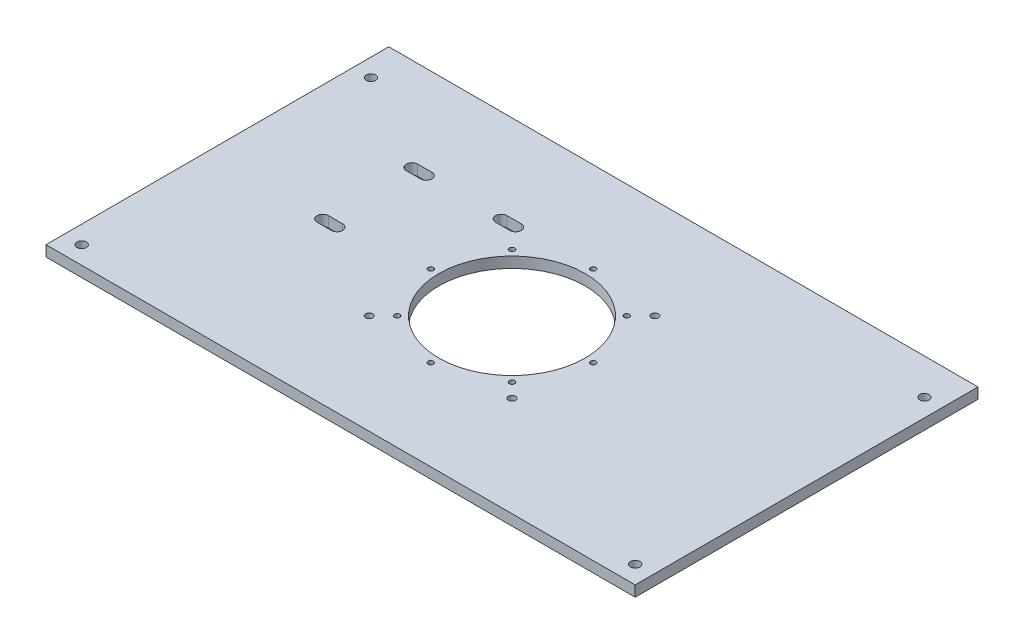
ISO-10303-21;
HEADER;
FILE_DESCRIPTION(('STEP AP214'),'2;1');
FILE_NAME('part.step','',(''),(''),'','','');
FILE_SCHEMA(('AUTOMOTIVE_DESIGN { 1 0 10303 214 1 1 1 1 }'));
ENDSEC;
DATA;
#1=APPLICATION_CONTEXT('core data for automotive mechanical design processes');
#2=APPLICATION_PROTOCOL_DEFINITION('international standard','automotive_design',2000,#1);
#3=PRODUCT_CONTEXT('',#1,'mechanical');
#4=PRODUCT('Part','Part','',(#3));
#5=PRODUCT_RELATED_PRODUCT_CATEGORY('part','',(#4));
#6=PRODUCT_DEFINITION_FORMATION('','',#4);
#7=PRODUCT_DEFINITION_CONTEXT('part definition',#1,'design');
#8=PRODUCT_DEFINITION('design','',#6,#7);
#9=PRODUCT_DEFINITION_SHAPE('','',#8);
#10=(LENGTH_UNIT() NAMED_UNIT(*) SI_UNIT(.MILLI.,.METRE.));
#11=(NAMED_UNIT(*) PLANE_ANGLE_UNIT() SI_UNIT($,.RADIAN.));
#12=(NAMED_UNIT(*) SI_UNIT($,.STERADIAN.) SOLID_ANGLE_UNIT());
#13=UNCERTAINTY_MEASURE_WITH_UNIT(LENGTH_MEASURE(1.E-05),#10,'distance_accuracy_value','');
#14=(GEOMETRIC_REPRESENTATION_CONTEXT(3) GLOBAL_UNCERTAINTY_ASSIGNED_CONTEXT((#13)) GLOBAL_UNIT_ASSIGNED_CONTEXT((#10,
#11,#12)) REPRESENTATION_CONTEXT('',''));
#15=CARTESIAN_POINT('',(0.,0.,0.));
#16=DIRECTION('',(0.,0.,1.));
#17=DIRECTION('',(1.,0.,0.));
#18=AXIS2_PLACEMENT_3D('',#15,#16,#17);
#19=CARTESIAN_POINT('',(0.,6.,0.));
#20=DIRECTION('',(1.,0.,0.));
#21=DIRECTION('',(0.,0.,-1.));
#22=AXIS2_PLACEMENT_3D('',#19,#20,#21);
#23=PLANE('',#22);
#24=DIRECTION('',(0.,0.,1.));
#25=VECTOR('',#24,1.);
#26=CARTESIAN_POINT('',(0.,0.,0.));
#27=LINE('',#26,#25);
#28=CARTESIAN_POINT('',(0.,0.,-192.));
#29=VERTEX_POINT('',#28);
#30=CARTESIAN_POINT('',(0.,0.,0.));
#31=VERTEX_POINT('',#30);
#32=EDGE_CURVE('E308',#29,#31,#27,.T.);
#33=ORIENTED_EDGE('',*,*,#32,.T.);
#34=DIRECTION('',(0.,-1.,0.));
#35=VECTOR('',#34,1.);
#36=CARTESIAN_POINT('',(0.,6.,0.));
#37=LINE('',#36,#35);
#38=CARTESIAN_POINT('',(0.,6.,0.));
#39=VERTEX_POINT('',#38);
#40=EDGE_CURVE('E11',#39,#31,#37,.T.);
#41=ORIENTED_EDGE('',*,*,#40,.F.);
#42=DIRECTION('',(0.,0.,1.));
#43=VECTOR('',#42,1.);
#44=CARTESIAN_POINT('',(0.,6.,0.));
#45=LINE('',#44,#43);
#46=CARTESIAN_POINT('',(0.,6.,-192.));
#47=VERTEX_POINT('',#46);
#48=EDGE_CURVE('E309',#47,#39,#45,.T.);
#49=ORIENTED_EDGE('',*,*,#48,.F.);
#50=DIRECTION('',(0.,-1.,0.));
#51=VECTOR('',#50,1.);
#52=CARTESIAN_POINT('',(0.,6.,-192.));
#53=LINE('',#52,#51);
#54=EDGE_CURVE('E319',#47,#29,#53,.T.);
#55=ORIENTED_EDGE('',*,*,#54,.T.);
#56=EDGE_LOOP('',(#33,#41,#49,#55));
#57=FACE_BOUND('',#56,.T.);
#58=ADVANCED_FACE('F38',(#57),#23,.F.);
#59=CARTESIAN_POINT('',(0.,6.,0.));
#60=DIRECTION('',(0.,0.,-1.));
#61=DIRECTION('',(-1.,0.,0.));
#62=AXIS2_PLACEMENT_3D('',#59,#60,#61);
#63=PLANE('',#62);
#64=DIRECTION('',(1.,0.,0.));
#65=VECTOR('',#64,1.);
#66=CARTESIAN_POINT('',(0.,0.,0.));
#67=LINE('',#66,#65);
#68=CARTESIAN_POINT('',(330.,0.,0.));
#69=VERTEX_POINT('',#68);
#70=EDGE_CURVE('E322',#31,#69,#67,.T.);
#71=ORIENTED_EDGE('',*,*,#70,.T.);
#72=DIRECTION('',(0.,-1.,0.));
#73=VECTOR('',#72,1.);
#74=CARTESIAN_POINT('',(330.,6.,0.));
#75=LINE('',#74,#73);
#76=CARTESIAN_POINT('',(330.,6.,0.));
#77=VERTEX_POINT('',#76);
#78=EDGE_CURVE('E46',#77,#69,#75,.T.);
#79=ORIENTED_EDGE('',*,*,#78,.F.);
#80=DIRECTION('',(1.,0.,0.));
#81=VECTOR('',#80,1.);
#82=CARTESIAN_POINT('',(0.,6.,0.));
#83=LINE('',#82,#81);
#84=EDGE_CURVE('E312',#39,#77,#83,.T.);
#85=ORIENTED_EDGE('',*,*,#84,.F.);
#86=ORIENTED_EDGE('',*,*,#40,.T.);
#87=EDGE_LOOP('',(#71,#79,#85,#86));
#88=FACE_BOUND('',#87,.T.);
#89=ADVANCED_FACE('F416',(#88),#63,.F.);
#90=CARTESIAN_POINT('',(330.,6.,0.));
#91=DIRECTION('',(-1.,0.,0.));
#92=DIRECTION('',(0.,0.,1.));
#93=AXIS2_PLACEMENT_3D('',#90,#91,#92);
#94=PLANE('',#93);
#95=DIRECTION('',(0.,0.,-1.));
#96=VECTOR('',#95,1.);
#97=CARTESIAN_POINT('',(330.,0.,0.));
#98=LINE('',#97,#96);
#99=CARTESIAN_POINT('',(330.,0.,-192.));
#100=VERTEX_POINT('',#99);
#101=EDGE_CURVE('E324',#69,#100,#98,.T.);
#102=ORIENTED_EDGE('',*,*,#101,.T.);
#103=DIRECTION('',(0.,-1.,0.));
#104=VECTOR('',#103,1.);
#105=CARTESIAN_POINT('',(330.,6.,-192.));
#106=LINE('',#105,#104);
#107=CARTESIAN_POINT('',(330.,6.,-192.));
#108=VERTEX_POINT('',#107);
#109=EDGE_CURVE('E329',#108,#100,#106,.T.);
#110=ORIENTED_EDGE('',*,*,#109,.F.);
#111=DIRECTION('',(0.,0.,-1.));
#112=VECTOR('',#111,1.);
#113=CARTESIAN_POINT('',(330.,6.,0.));
#114=LINE('',#113,#112);
#115=EDGE_CURVE('E315',#77,#108,#114,.T.);
#116=ORIENTED_EDGE('',*,*,#115,.F.);
#117=ORIENTED_EDGE('',*,*,#78,.T.);
#118=EDGE_LOOP('',(#102,#110,#116,#117));
#119=FACE_BOUND('',#118,.T.);
#120=ADVANCED_FACE('F421',(#119),#94,.F.);
#121=CARTESIAN_POINT('',(0.,6.,-192.));
#122=DIRECTION('',(0.,0.,1.));
#123=DIRECTION('',(1.,0.,0.));
#124=AXIS2_PLACEMENT_3D('',#121,#122,#123);
#125=PLANE('',#124);
#126=DIRECTION('',(-1.,0.,0.));
#127=VECTOR('',#126,1.);
#128=CARTESIAN_POINT('',(0.,0.,-192.));
#129=LINE('',#128,#127);
#130=EDGE_CURVE('E313',#100,#29,#129,.T.);
#131=ORIENTED_EDGE('',*,*,#130,.T.);
#132=ORIENTED_EDGE('',*,*,#54,.F.);
#133=DIRECTION('',(-1.,0.,0.));
#134=VECTOR('',#133,1.);
#135=CARTESIAN_POINT('',(0.,6.,-192.));
#136=LINE('',#135,#134);
#137=EDGE_CURVE('E317',#108,#47,#136,.T.);
#138=ORIENTED_EDGE('',*,*,#137,.F.);
#139=ORIENTED_EDGE('',*,*,#109,.T.);
#140=EDGE_LOOP('',(#131,#132,#138,#139));
#141=FACE_BOUND('',#140,.T.);
#142=ADVANCED_FACE('F383',(#141),#125,.F.);
#143=CARTESIAN_POINT('',(0.,6.,0.));
#144=DIRECTION('',(0.,-1.,0.));
#145=DIRECTION('',(0.,0.,-1.));
#146=AXIS2_PLACEMENT_3D('',#143,#144,#145);
#147=PLANE('',#146);
#148=CARTESIAN_POINT('',(10.,6.,-172.));
#149=DIRECTION('',(0.,1.,0.));
#150=DIRECTION('',(0.,0.,1.));
#151=AXIS2_PLACEMENT_3D('',#148,#149,#150);
#152=CIRCLE('',#151,2.65);
#153=CARTESIAN_POINT('',(10.,6.,-169.35));
#154=VERTEX_POINT('',#153);
#155=EDGE_CURVE('E354',#154,#154,#152,.T.);
#156=ORIENTED_EDGE('',*,*,#155,.F.);
#157=EDGE_LOOP('',(#156));
#158=FACE_BOUND('',#157,.T.);
#159=CARTESIAN_POINT('',(10.,6.,-10.));
#160=DIRECTION('',(0.,1.,0.));
#161=DIRECTION('',(0.,0.,1.));
#162=AXIS2_PLACEMENT_3D('',#159,#160,#161);
#163=CIRCLE('',#162,2.65);
#164=CARTESIAN_POINT('',(10.,6.,-7.35000000000001));
#165=VERTEX_POINT('',#164);
#166=EDGE_CURVE('E344',#165,#165,#163,.T.);
#167=ORIENTED_EDGE('',*,*,#166,.F.);
#168=EDGE_LOOP('',(#167));
#169=FACE_BOUND('',#168,.T.);
#170=CARTESIAN_POINT('',(320.,6.,-10.));
#171=DIRECTION('',(0.,1.,0.));
#172=DIRECTION('',(0.,0.,1.));
#173=AXIS2_PLACEMENT_3D('',#170,#171,#172);
#174=CIRCLE('',#173,2.64999999999999);
#175=CARTESIAN_POINT('',(320.,6.,-7.35000000000002));
#176=VERTEX_POINT('',#175);
#177=EDGE_CURVE('E341',#176,#176,#174,.T.);
#178=ORIENTED_EDGE('',*,*,#177,.F.);
#179=EDGE_LOOP('',(#178));
#180=FACE_BOUND('',#179,.T.);
#181=CARTESIAN_POINT('',(320.,6.,-172.));
#182=DIRECTION('',(0.,1.,0.));
#183=DIRECTION('',(0.,0.,1.));
#184=AXIS2_PLACEMENT_3D('',#181,#182,#183);
#185=CIRCLE('',#184,2.64999999999999);
#186=CARTESIAN_POINT('',(320.,6.,-169.35));
#187=VERTEX_POINT('',#186);
#188=EDGE_CURVE('E338',#187,#187,#185,.T.);
#189=ORIENTED_EDGE('',*,*,#188,.F.);
#190=EDGE_LOOP('',(#189));
#191=FACE_BOUND('',#190,.T.);
#192=CARTESIAN_POINT('',(205.,6.,-136.));
#193=DIRECTION('',(0.,-1.,0.));
#194=DIRECTION('',(0.,0.,-1.));
#195=AXIS2_PLACEMENT_3D('',#192,#193,#194);
#196=CIRCLE('',#195,2.);
#197=CARTESIAN_POINT('',(205.,6.,-138.));
#198=VERTEX_POINT('',#197);
#199=EDGE_CURVE('E206',#198,#198,#196,.T.);
#200=ORIENTED_EDGE('',*,*,#199,.T.);
#201=EDGE_LOOP('',(#200));
#202=FACE_BOUND('',#201,.T.);
#203=CARTESIAN_POINT('',(205.,6.,-56.));
#204=DIRECTION('',(0.,-1.,0.));
#205=DIRECTION('',(0.,0.,-1.));
#206=AXIS2_PLACEMENT_3D('',#203,#204,#205);
#207=CIRCLE('',#206,2.);
#208=CARTESIAN_POINT('',(205.,6.,-58.));
#209=VERTEX_POINT('',#208);
#210=EDGE_CURVE('E370',#209,#209,#207,.T.);
#211=ORIENTED_EDGE('',*,*,#210,.T.);
#212=EDGE_LOOP('',(#211));
#213=FACE_BOUND('',#212,.T.);
#214=CARTESIAN_POINT('',(125.,6.,-56.));
#215=DIRECTION('',(0.,-1.,0.));
#216=DIRECTION('',(0.,0.,-1.));
#217=AXIS2_PLACEMENT_3D('',#214,#215,#216);
#218=CIRCLE('',#217,2.);
#219=CARTESIAN_POINT('',(125.,6.,-58.));
#220=VERTEX_POINT('',#219);
#221=EDGE_CURVE('E362',#220,#220,#218,.T.);
#222=ORIENTED_EDGE('',*,*,#221,.T.);
#223=EDGE_LOOP('',(#222));
#224=FACE_BOUND('',#223,.T.);
#225=CARTESIAN_POINT('',(123.,6.,-140.));
#226=DIRECTION('',(0.,-1.,0.));
#227=DIRECTION('',(0.,0.,-1.));
#228=AXIS2_PLACEMENT_3D('',#225,#226,#227);
#229=CIRCLE('',#228,3.20000000000001);
#230=CARTESIAN_POINT('',(123.,6.,-143.2));
#231=VERTEX_POINT('',#230);
#232=CARTESIAN_POINT('',(123.,6.,-136.8));
#233=VERTEX_POINT('',#232);
#234=EDGE_CURVE('E248',#231,#233,#229,.T.);
#235=ORIENTED_EDGE('',*,*,#234,.T.);
#236=DIRECTION('',(-1.,0.,0.));
#237=VECTOR('',#236,1.);
#238=CARTESIAN_POINT('',(0.,6.,-136.8));
#239=LINE('',#238,#237);
#240=CARTESIAN_POINT('',(115.,6.,-136.8));
#241=VERTEX_POINT('',#240);
#242=EDGE_CURVE('E251',#233,#241,#239,.T.);
#243=ORIENTED_EDGE('',*,*,#242,.T.);
#244=CARTESIAN_POINT('',(115.,6.,-140.));
#245=DIRECTION('',(0.,-1.,0.));
#246=DIRECTION('',(0.,0.,-1.));
#247=AXIS2_PLACEMENT_3D('',#244,#245,#246);
#248=CIRCLE('',#247,3.19999999999998);
#249=CARTESIAN_POINT('',(115.,6.,-143.2));
#250=VERTEX_POINT('',#249);
#251=EDGE_CURVE('E245',#241,#250,#248,.T.);
#252=ORIENTED_EDGE('',*,*,#251,.T.);
#253=DIRECTION('',(-1.,0.,0.));
#254=VECTOR('',#253,1.);
#255=CARTESIAN_POINT('',(0.,6.,-143.2));
#256=LINE('',#255,#254);
#257=EDGE_CURVE('E157',#231,#250,#256,.T.);
#258=ORIENTED_EDGE('',*,*,#257,.F.);
#259=EDGE_LOOP('',(#235,#243,#252,#258));
#260=FACE_BOUND('',#259,.T.);
#261=CARTESIAN_POINT('',(73.,6.,-140.));
#262=DIRECTION('',(0.,-1.,0.));
#263=DIRECTION('',(0.,0.,-1.));
#264=AXIS2_PLACEMENT_3D('',#261,#262,#263);
#265=CIRCLE('',#264,3.19999999999999);
#266=CARTESIAN_POINT('',(73.,6.,-143.2));
#267=VERTEX_POINT('',#266);
#268=CARTESIAN_POINT('',(73.,6.,-136.8));
#269=VERTEX_POINT('',#268);
#270=EDGE_CURVE('E239',#267,#269,#265,.T.);
#271=ORIENTED_EDGE('',*,*,#270,.T.);
#272=DIRECTION('',(-1.,0.,0.));
#273=VECTOR('',#272,1.);
#274=CARTESIAN_POINT('',(4.74620343027258E-13,6.,-136.8));
#275=LINE('',#274,#273);
#276=CARTESIAN_POINT('',(65.,6.,-136.8));
#277=VERTEX_POINT('',#276);
#278=EDGE_CURVE('E242',#269,#277,#275,.T.);
#279=ORIENTED_EDGE('',*,*,#278,.T.);
#280=CARTESIAN_POINT('',(65.,6.,-140.));
#281=DIRECTION('',(0.,-1.,0.));
#282=DIRECTION('',(0.,0.,-1.));
#283=AXIS2_PLACEMENT_3D('',#280,#281,#282);
#284=CIRCLE('',#283,3.20000000000001);
#285=CARTESIAN_POINT('',(65.,6.,-143.2));
#286=VERTEX_POINT('',#285);
#287=EDGE_CURVE('E234',#277,#286,#284,.T.);
#288=ORIENTED_EDGE('',*,*,#287,.T.);
#289=DIRECTION('',(-1.,0.,0.));
#290=VECTOR('',#289,1.);
#291=CARTESIAN_POINT('',(-4.9682480351976E-13,6.,-143.2));
#292=LINE('',#291,#290);
#293=EDGE_CURVE('E237',#267,#286,#292,.T.);
#294=ORIENTED_EDGE('',*,*,#293,.F.);
#295=EDGE_LOOP('',(#271,#279,#288,#294));
#296=FACE_BOUND('',#295,.T.);
#297=CARTESIAN_POINT('',(73.,6.,-90.));
#298=DIRECTION('',(0.,-1.,0.));
#299=DIRECTION('',(0.,0.,-1.));
#300=AXIS2_PLACEMENT_3D('',#297,#298,#299);
#301=CIRCLE('',#300,3.19999999999999);
#302=CARTESIAN_POINT('',(73.,6.,-93.2));
#303=VERTEX_POINT('',#302);
#304=CARTESIAN_POINT('',(73.,6.,-86.8));
#305=VERTEX_POINT('',#304);
#306=EDGE_CURVE('E228',#303,#305,#301,.T.);
#307=ORIENTED_EDGE('',*,*,#306,.T.);
#308=DIRECTION('',(-1.,0.,0.));
#309=VECTOR('',#308,1.);
#310=CARTESIAN_POINT('',(-1.50573997714787E-13,6.,-86.7999999999999));
#311=LINE('',#310,#309);
#312=CARTESIAN_POINT('',(65.,6.,-86.8));
#313=VERTEX_POINT('',#312);
#314=EDGE_CURVE('E231',#305,#313,#311,.T.);
#315=ORIENTED_EDGE('',*,*,#314,.T.);
#316=CARTESIAN_POINT('',(65.,6.,-90.));
#317=DIRECTION('',(0.,-1.,0.));
#318=DIRECTION('',(0.,0.,-1.));
#319=AXIS2_PLACEMENT_3D('',#316,#317,#318);
#320=CIRCLE('',#319,3.19999999999999);
#321=CARTESIAN_POINT('',(65.,6.,-93.2));
#322=VERTEX_POINT('',#321);
#323=EDGE_CURVE('E181',#313,#322,#320,.T.);
#324=ORIENTED_EDGE('',*,*,#323,.T.);
#325=DIRECTION('',(-1.,0.,0.));
#326=VECTOR('',#325,1.);
#327=CARTESIAN_POINT('',(1.61676227961039E-13,6.,-93.2000000000001));
#328=LINE('',#327,#326);
#329=EDGE_CURVE('E225',#303,#322,#328,.T.);
#330=ORIENTED_EDGE('',*,*,#329,.F.);
#331=EDGE_LOOP('',(#307,#315,#324,#330));
#332=FACE_BOUND('',#331,.T.);
#333=CARTESIAN_POINT('',(165.,6.,-96.));
#334=DIRECTION('',(0.,1.,0.));
#335=DIRECTION('',(0.,0.,1.));
#336=AXIS2_PLACEMENT_3D('',#333,#334,#335);
#337=CIRCLE('',#336,41.);
#338=CARTESIAN_POINT('',(165.,6.,-55.));
#339=VERTEX_POINT('',#338);
#340=EDGE_CURVE('E254',#339,#339,#337,.T.);
#341=ORIENTED_EDGE('',*,*,#340,.F.);
#342=EDGE_LOOP('',(#341));
#343=FACE_BOUND('',#342,.T.);
#344=CARTESIAN_POINT('',(165.,6.,-141.5));
#345=DIRECTION('',(0.,-1.,0.));
#346=DIRECTION('',(0.,0.,-1.));
#347=AXIS2_PLACEMENT_3D('',#344,#345,#346);
#348=CIRCLE('',#347,1.5);
#349=CARTESIAN_POINT('',(165.,6.,-143.));
#350=VERTEX_POINT('',#349);
#351=EDGE_CURVE('E305',#350,#350,#348,.T.);
#352=ORIENTED_EDGE('',*,*,#351,.T.);
#353=EDGE_LOOP('',(#352));
#354=FACE_BOUND('',#353,.T.);
#355=CARTESIAN_POINT('',(197.173358543988,6.,-63.8266414560121));
#356=DIRECTION('',(0.,-1.,0.));
#357=DIRECTION('',(0.,0.,-1.));
#358=AXIS2_PLACEMENT_3D('',#355,#356,#357);
#359=CIRCLE('',#358,1.5);
#360=CARTESIAN_POINT('',(197.173358543988,6.,-65.3266414560121));
#361=VERTEX_POINT('',#360);
#362=EDGE_CURVE('E302',#361,#361,#359,.T.);
#363=ORIENTED_EDGE('',*,*,#362,.T.);
#364=EDGE_LOOP('',(#363));
#365=FACE_BOUND('',#364,.T.);
#366=CARTESIAN_POINT('',(132.826641456012,6.,-128.173358543988));
#367=DIRECTION('',(0.,-1.,0.));
#368=DIRECTION('',(0.,0.,-1.));
#369=AXIS2_PLACEMENT_3D('',#366,#367,#368);
#370=CIRCLE('',#369,1.5);
#371=CARTESIAN_POINT('',(132.826641456012,6.,-129.673358543988));
#372=VERTEX_POINT('',#371);
#373=EDGE_CURVE('E299',#372,#372,#370,.T.);
#374=ORIENTED_EDGE('',*,*,#373,.T.);
#375=EDGE_LOOP('',(#374));
#376=FACE_BOUND('',#375,.T.);
#377=CARTESIAN_POINT('',(119.5,6.,-96.));
#378=DIRECTION('',(0.,-1.,0.));
#379=DIRECTION('',(0.,0.,-1.));
#380=AXIS2_PLACEMENT_3D('',#377,#378,#379);
#381=CIRCLE('',#380,1.5);
#382=CARTESIAN_POINT('',(119.5,6.,-97.5));
#383=VERTEX_POINT('',#382);
#384=EDGE_CURVE('E296',#383,#383,#381,.T.);
#385=ORIENTED_EDGE('',*,*,#384,.T.);
#386=EDGE_LOOP('',(#385));
#387=FACE_BOUND('',#386,.T.);
#388=CARTESIAN_POINT('',(132.826641456012,6.,-63.8266414560121));
#389=DIRECTION('',(0.,-1.,0.));
#390=DIRECTION('',(0.,0.,-1.));
#391=AXIS2_PLACEMENT_3D('',#388,#389,#390);
#392=CIRCLE('',#391,1.5);
#393=CARTESIAN_POINT('',(132.826641456012,6.,-65.3266414560121));
#394=VERTEX_POINT('',#393);
#395=EDGE_CURVE('E293',#394,#394,#392,.T.);
#396=ORIENTED_EDGE('',*,*,#395,.T.);
#397=EDGE_LOOP('',(#396));
#398=FACE_BOUND('',#397,.T.);
#399=CARTESIAN_POINT('',(165.,6.,-50.5000000000001));
#400=DIRECTION('',(0.,-1.,0.));
#401=DIRECTION('',(0.,0.,-1.));
#402=AXIS2_PLACEMENT_3D('',#399,#400,#401);
#403=CIRCLE('',#402,1.5);
#404=CARTESIAN_POINT('',(165.,6.,-52.0000000000001));
#405=VERTEX_POINT('',#404);
#406=EDGE_CURVE('E290',#405,#405,#403,.T.);
#407=ORIENTED_EDGE('',*,*,#406,.T.);
#408=EDGE_LOOP('',(#407));
#409=FACE_BOUND('',#408,.T.);
#410=CARTESIAN_POINT('',(210.5,6.,-96.));
#411=DIRECTION('',(0.,-1.,0.));
#412=DIRECTION('',(0.,0.,-1.));
#413=AXIS2_PLACEMENT_3D('',#410,#411,#412);
#414=CIRCLE('',#413,1.5);
#415=CARTESIAN_POINT('',(210.5,6.,-97.5));
#416=VERTEX_POINT('',#415);
#417=EDGE_CURVE('E287',#416,#416,#414,.T.);
#418=ORIENTED_EDGE('',*,*,#417,.T.);
#419=EDGE_LOOP('',(#418));
#420=FACE_BOUND('',#419,.T.);
#421=CARTESIAN_POINT('',(197.173358543988,6.,-128.173358543988));
#422=DIRECTION('',(0.,-1.,0.));
#423=DIRECTION('',(0.,0.,-1.));
#424=AXIS2_PLACEMENT_3D('',#421,#422,#423);
#425=CIRCLE('',#424,1.5);
#426=CARTESIAN_POINT('',(197.173358543988,6.,-129.673358543988));
#427=VERTEX_POINT('',#426);
#428=EDGE_CURVE('E264',#427,#427,#425,.T.);
#429=ORIENTED_EDGE('',*,*,#428,.T.);
#430=EDGE_LOOP('',(#429));
#431=FACE_BOUND('',#430,.T.);
#432=ORIENTED_EDGE('',*,*,#48,.T.);
#433=ORIENTED_EDGE('',*,*,#84,.T.);
#434=ORIENTED_EDGE('',*,*,#115,.T.);
#435=ORIENTED_EDGE('',*,*,#137,.T.);
#436=EDGE_LOOP('',(#432,#433,#434,#435));
#437=FACE_BOUND('',#436,.T.);
#438=ADVANCED_FACE('F380',(#158,#169,#180,#191,#202,#213,#224,#260,#296,#332,#343,#354,#365,
#376,#387,#398,#409,#420,#431,#437),#147,.F.);
#439=CARTESIAN_POINT('',(0.,0.,0.));
#440=DIRECTION('',(0.,-1.,0.));
#441=DIRECTION('',(0.,0.,-1.));
#442=AXIS2_PLACEMENT_3D('',#439,#440,#441);
#443=PLANE('',#442);
#444=CARTESIAN_POINT('',(10.,0.,-172.));
#445=DIRECTION('',(0.,-1.,0.));
#446=DIRECTION('',(0.,0.,-1.));
#447=AXIS2_PLACEMENT_3D('',#444,#445,#446);
#448=CIRCLE('',#447,2.65);
#449=CARTESIAN_POINT('',(10.,0.,-174.65));
#450=VERTEX_POINT('',#449);
#451=EDGE_CURVE('E41',#450,#450,#448,.T.);
#452=ORIENTED_EDGE('',*,*,#451,.F.);
#453=EDGE_LOOP('',(#452));
#454=FACE_BOUND('',#453,.T.);
#455=CARTESIAN_POINT('',(10.,0.,-10.));
#456=DIRECTION('',(0.,-1.,0.));
#457=DIRECTION('',(0.,0.,-1.));
#458=AXIS2_PLACEMENT_3D('',#455,#456,#457);
#459=CIRCLE('',#458,2.65);
#460=CARTESIAN_POINT('',(10.,0.,-12.65));
#461=VERTEX_POINT('',#460);
#462=EDGE_CURVE('E342',#461,#461,#459,.T.);
#463=ORIENTED_EDGE('',*,*,#462,.F.);
#464=EDGE_LOOP('',(#463));
#465=FACE_BOUND('',#464,.T.);
#466=CARTESIAN_POINT('',(320.,0.,-10.));
#467=DIRECTION('',(0.,-1.,0.));
#468=DIRECTION('',(0.,0.,-1.));
#469=AXIS2_PLACEMENT_3D('',#466,#467,#468);
#470=CIRCLE('',#469,2.64999999999999);
#471=CARTESIAN_POINT('',(320.,0.,-12.65));
#472=VERTEX_POINT('',#471);
#473=EDGE_CURVE('E339',#472,#472,#470,.T.);
#474=ORIENTED_EDGE('',*,*,#473,.F.);
#475=EDGE_LOOP('',(#474));
#476=FACE_BOUND('',#475,.T.);
#477=CARTESIAN_POINT('',(320.,0.,-172.));
#478=DIRECTION('',(0.,-1.,0.));
#479=DIRECTION('',(0.,0.,-1.));
#480=AXIS2_PLACEMENT_3D('',#477,#478,#479);
#481=CIRCLE('',#480,2.64999999999999);
#482=CARTESIAN_POINT('',(320.,0.,-174.65));
#483=VERTEX_POINT('',#482);
#484=EDGE_CURVE('E334',#483,#483,#481,.T.);
#485=ORIENTED_EDGE('',*,*,#484,.F.);
#486=EDGE_LOOP('',(#485));
#487=FACE_BOUND('',#486,.T.);
#488=CARTESIAN_POINT('',(205.,0.,-136.));
#489=DIRECTION('',(0.,-1.,0.));
#490=DIRECTION('',(0.,0.,-1.));
#491=AXIS2_PLACEMENT_3D('',#488,#489,#490);
#492=CIRCLE('',#491,2.);
#493=CARTESIAN_POINT('',(205.,0.,-138.));
#494=VERTEX_POINT('',#493);
#495=EDGE_CURVE('E359',#494,#494,#492,.T.);
#496=ORIENTED_EDGE('',*,*,#495,.F.);
#497=EDGE_LOOP('',(#496));
#498=FACE_BOUND('',#497,.T.);
#499=CARTESIAN_POINT('',(205.,0.,-56.));
#500=DIRECTION('',(0.,-1.,0.));
#501=DIRECTION('',(0.,0.,-1.));
#502=AXIS2_PLACEMENT_3D('',#499,#500,#501);
#503=CIRCLE('',#502,2.);
#504=CARTESIAN_POINT('',(205.,0.,-58.));
#505=VERTEX_POINT('',#504);
#506=EDGE_CURVE('E363',#505,#505,#503,.T.);
#507=ORIENTED_EDGE('',*,*,#506,.F.);
#508=EDGE_LOOP('',(#507));
#509=FACE_BOUND('',#508,.T.);
#510=CARTESIAN_POINT('',(125.,0.,-56.));
#511=DIRECTION('',(0.,-1.,0.));
#512=DIRECTION('',(0.,0.,-1.));
#513=AXIS2_PLACEMENT_3D('',#510,#511,#512);
#514=CIRCLE('',#513,2.);
#515=CARTESIAN_POINT('',(125.,0.,-58.));
#516=VERTEX_POINT('',#515);
#517=EDGE_CURVE('E337',#516,#516,#514,.T.);
#518=ORIENTED_EDGE('',*,*,#517,.F.);
#519=EDGE_LOOP('',(#518));
#520=FACE_BOUND('',#519,.T.);
#521=DIRECTION('',(-1.,0.,0.));
#522=VECTOR('',#521,1.);
#523=CARTESIAN_POINT('',(0.,0.,-136.8));
#524=LINE('',#523,#522);
#525=CARTESIAN_POINT('',(123.,0.,-136.8));
#526=VERTEX_POINT('',#525);
#527=CARTESIAN_POINT('',(115.,0.,-136.8));
#528=VERTEX_POINT('',#527);
#529=EDGE_CURVE('E169',#526,#528,#524,.T.);
#530=ORIENTED_EDGE('',*,*,#529,.F.);
#531=CARTESIAN_POINT('',(123.,0.,-140.));
#532=DIRECTION('',(0.,-1.,0.));
#533=DIRECTION('',(0.,0.,-1.));
#534=AXIS2_PLACEMENT_3D('',#531,#532,#533);
#535=CIRCLE('',#534,3.20000000000001);
#536=CARTESIAN_POINT('',(123.,0.,-143.2));
#537=VERTEX_POINT('',#536);
#538=EDGE_CURVE('E174',#537,#526,#535,.T.);
#539=ORIENTED_EDGE('',*,*,#538,.F.);
#540=DIRECTION('',(-1.,0.,0.));
#541=VECTOR('',#540,1.);
#542=CARTESIAN_POINT('',(0.,0.,-143.2));
#543=LINE('',#542,#541);
#544=CARTESIAN_POINT('',(115.,0.,-143.2));
#545=VERTEX_POINT('',#544);
#546=EDGE_CURVE('E154',#537,#545,#543,.T.);
#547=ORIENTED_EDGE('',*,*,#546,.T.);
#548=CARTESIAN_POINT('',(115.,0.,-140.));
#549=DIRECTION('',(0.,-1.,0.));
#550=DIRECTION('',(0.,0.,-1.));
#551=AXIS2_PLACEMENT_3D('',#548,#549,#550);
#552=CIRCLE('',#551,3.19999999999998);
#553=EDGE_CURVE('E164',#528,#545,#552,.T.);
#554=ORIENTED_EDGE('',*,*,#553,.F.);
#555=EDGE_LOOP('',(#530,#539,#547,#554));
#556=FACE_BOUND('',#555,.T.);
#557=DIRECTION('',(-1.,0.,0.));
#558=VECTOR('',#557,1.);
#559=CARTESIAN_POINT('',(4.74620343027258E-13,0.,-136.8));
#560=LINE('',#559,#558);
#561=CARTESIAN_POINT('',(73.,0.,-136.8));
#562=VERTEX_POINT('',#561);
#563=CARTESIAN_POINT('',(65.,0.,-136.8));
#564=VERTEX_POINT('',#563);
#565=EDGE_CURVE('E184',#562,#564,#560,.T.);
#566=ORIENTED_EDGE('',*,*,#565,.F.);
#567=CARTESIAN_POINT('',(73.,0.,-140.));
#568=DIRECTION('',(0.,-1.,0.));
#569=DIRECTION('',(0.,0.,-1.));
#570=AXIS2_PLACEMENT_3D('',#567,#568,#569);
#571=CIRCLE('',#570,3.19999999999999);
#572=CARTESIAN_POINT('',(73.,0.,-143.2));
#573=VERTEX_POINT('',#572);
#574=EDGE_CURVE('E192',#573,#562,#571,.T.);
#575=ORIENTED_EDGE('',*,*,#574,.F.);
#576=DIRECTION('',(-1.,0.,0.));
#577=VECTOR('',#576,1.);
#578=CARTESIAN_POINT('',(-4.9682480351976E-13,0.,-143.2));
#579=LINE('',#578,#577);
#580=CARTESIAN_POINT('',(65.,0.,-143.2));
#581=VERTEX_POINT('',#580);
#582=EDGE_CURVE('E189',#573,#581,#579,.T.);
#583=ORIENTED_EDGE('',*,*,#582,.T.);
#584=CARTESIAN_POINT('',(65.,0.,-140.));
#585=DIRECTION('',(0.,-1.,0.));
#586=DIRECTION('',(0.,0.,-1.));
#587=AXIS2_PLACEMENT_3D('',#584,#585,#586);
#588=CIRCLE('',#587,3.20000000000001);
#589=EDGE_CURVE('E186',#564,#581,#588,.T.);
#590=ORIENTED_EDGE('',*,*,#589,.F.);
#591=EDGE_LOOP('',(#566,#575,#583,#590));
#592=FACE_BOUND('',#591,.T.);
#593=DIRECTION('',(-1.,0.,0.));
#594=VECTOR('',#593,1.);
#595=CARTESIAN_POINT('',(-1.50573997714787E-13,0.,-86.7999999999999));
#596=LINE('',#595,#594);
#597=CARTESIAN_POINT('',(73.,0.,-86.8));
#598=VERTEX_POINT('',#597);
#599=CARTESIAN_POINT('',(65.,0.,-86.8));
#600=VERTEX_POINT('',#599);
#601=EDGE_CURVE('E203',#598,#600,#596,.T.);
#602=ORIENTED_EDGE('',*,*,#601,.F.);
#603=CARTESIAN_POINT('',(73.,0.,-90.));
#604=DIRECTION('',(0.,-1.,0.));
#605=DIRECTION('',(0.,0.,-1.));
#606=AXIS2_PLACEMENT_3D('',#603,#604,#605);
#607=CIRCLE('',#606,3.19999999999999);
#608=CARTESIAN_POINT('',(73.,0.,-93.2));
#609=VERTEX_POINT('',#608);
#610=EDGE_CURVE('E212',#609,#598,#607,.T.);
#611=ORIENTED_EDGE('',*,*,#610,.F.);
#612=DIRECTION('',(-1.,0.,0.));
#613=VECTOR('',#612,1.);
#614=CARTESIAN_POINT('',(1.61676227961039E-13,0.,-93.2000000000001));
#615=LINE('',#614,#613);
#616=CARTESIAN_POINT('',(65.,0.,-93.2));
#617=VERTEX_POINT('',#616);
#618=EDGE_CURVE('E209',#609,#617,#615,.T.);
#619=ORIENTED_EDGE('',*,*,#618,.T.);
#620=CARTESIAN_POINT('',(65.,0.,-90.));
#621=DIRECTION('',(0.,-1.,0.));
#622=DIRECTION('',(0.,0.,-1.));
#623=AXIS2_PLACEMENT_3D('',#620,#621,#622);
#624=CIRCLE('',#623,3.19999999999999);
#625=EDGE_CURVE('E205',#600,#617,#624,.T.);
#626=ORIENTED_EDGE('',*,*,#625,.F.);
#627=EDGE_LOOP('',(#602,#611,#619,#626));
#628=FACE_BOUND('',#627,.T.);
#629=CARTESIAN_POINT('',(165.,0.,-96.));
#630=DIRECTION('',(0.,1.,0.));
#631=DIRECTION('',(0.,0.,1.));
#632=AXIS2_PLACEMENT_3D('',#629,#630,#631);
#633=CIRCLE('',#632,41.);
#634=CARTESIAN_POINT('',(165.,0.,-55.));
#635=VERTEX_POINT('',#634);
#636=EDGE_CURVE('E255',#635,#635,#633,.T.);
#637=ORIENTED_EDGE('',*,*,#636,.T.);
#638=EDGE_LOOP('',(#637));
#639=FACE_BOUND('',#638,.T.);
#640=CARTESIAN_POINT('',(165.,0.,-141.5));
#641=DIRECTION('',(0.,1.,0.));
#642=DIRECTION('',(0.,0.,1.));
#643=AXIS2_PLACEMENT_3D('',#640,#641,#642);
#644=CIRCLE('',#643,1.5);
#645=CARTESIAN_POINT('',(165.,0.,-140.));
#646=VERTEX_POINT('',#645);
#647=EDGE_CURVE('E261',#646,#646,#644,.T.);
#648=ORIENTED_EDGE('',*,*,#647,.T.);
#649=EDGE_LOOP('',(#648));
#650=FACE_BOUND('',#649,.T.);
#651=CARTESIAN_POINT('',(197.173358543988,0.,-63.8266414560121));
#652=DIRECTION('',(0.,1.,0.));
#653=DIRECTION('',(0.,0.,1.));
#654=AXIS2_PLACEMENT_3D('',#651,#652,#653);
#655=CIRCLE('',#654,1.5);
#656=CARTESIAN_POINT('',(197.173358543988,0.,-62.3266414560121));
#657=VERTEX_POINT('',#656);
#658=EDGE_CURVE('E258',#657,#657,#655,.T.);
#659=ORIENTED_EDGE('',*,*,#658,.T.);
#660=EDGE_LOOP('',(#659));
#661=FACE_BOUND('',#660,.T.);
#662=CARTESIAN_POINT('',(132.826641456012,0.,-128.173358543988));
#663=DIRECTION('',(0.,1.,0.));
#664=DIRECTION('',(0.,0.,1.));
#665=AXIS2_PLACEMENT_3D('',#662,#663,#664);
#666=CIRCLE('',#665,1.5);
#667=CARTESIAN_POINT('',(132.826641456012,0.,-126.673358543988));
#668=VERTEX_POINT('',#667);
#669=EDGE_CURVE('E270',#668,#668,#666,.T.);
#670=ORIENTED_EDGE('',*,*,#669,.T.);
#671=EDGE_LOOP('',(#670));
#672=FACE_BOUND('',#671,.T.);
#673=CARTESIAN_POINT('',(119.5,0.,-96.));
#674=DIRECTION('',(0.,1.,0.));
#675=DIRECTION('',(0.,0.,1.));
#676=AXIS2_PLACEMENT_3D('',#673,#674,#675);
#677=CIRCLE('',#676,1.5);
#678=CARTESIAN_POINT('',(119.5,0.,-94.5));
#679=VERTEX_POINT('',#678);
#680=EDGE_CURVE('E266',#679,#679,#677,.T.);
#681=ORIENTED_EDGE('',*,*,#680,.T.);
#682=EDGE_LOOP('',(#681));
#683=FACE_BOUND('',#682,.T.);
#684=CARTESIAN_POINT('',(132.826641456012,0.,-63.8266414560121));
#685=DIRECTION('',(0.,1.,0.));
#686=DIRECTION('',(0.,0.,1.));
#687=AXIS2_PLACEMENT_3D('',#684,#685,#686);
#688=CIRCLE('',#687,1.5);
#689=CARTESIAN_POINT('',(132.826641456012,0.,-62.3266414560121));
#690=VERTEX_POINT('',#689);
#691=EDGE_CURVE('E269',#690,#690,#688,.T.);
#692=ORIENTED_EDGE('',*,*,#691,.T.);
#693=EDGE_LOOP('',(#692));
#694=FACE_BOUND('',#693,.T.);
#695=CARTESIAN_POINT('',(165.,0.,-50.5000000000001));
#696=DIRECTION('',(0.,1.,0.));
#697=DIRECTION('',(0.,0.,1.));
#698=AXIS2_PLACEMENT_3D('',#695,#696,#697);
#699=CIRCLE('',#698,1.5);
#700=CARTESIAN_POINT('',(165.,0.,-49.0000000000001));
#701=VERTEX_POINT('',#700);
#702=EDGE_CURVE('E280',#701,#701,#699,.T.);
#703=ORIENTED_EDGE('',*,*,#702,.T.);
#704=EDGE_LOOP('',(#703));
#705=FACE_BOUND('',#704,.T.);
#706=CARTESIAN_POINT('',(210.5,0.,-96.));
#707=DIRECTION('',(0.,1.,0.));
#708=DIRECTION('',(0.,0.,1.));
#709=AXIS2_PLACEMENT_3D('',#706,#707,#708);
#710=CIRCLE('',#709,1.5);
#711=CARTESIAN_POINT('',(210.5,0.,-94.5));
#712=VERTEX_POINT('',#711);
#713=EDGE_CURVE('E277',#712,#712,#710,.T.);
#714=ORIENTED_EDGE('',*,*,#713,.T.);
#715=EDGE_LOOP('',(#714));
#716=FACE_BOUND('',#715,.T.);
#717=CARTESIAN_POINT('',(197.173358543988,0.,-128.173358543988));
#718=DIRECTION('',(0.,1.,0.));
#719=DIRECTION('',(0.,0.,1.));
#720=AXIS2_PLACEMENT_3D('',#717,#718,#719);
#721=CIRCLE('',#720,1.5);
#722=CARTESIAN_POINT('',(197.173358543988,0.,-126.673358543988));
#723=VERTEX_POINT('',#722);
#724=EDGE_CURVE('E265',#723,#723,#721,.T.);
#725=ORIENTED_EDGE('',*,*,#724,.T.);
#726=EDGE_LOOP('',(#725));
#727=FACE_BOUND('',#726,.T.);
#728=ORIENTED_EDGE('',*,*,#32,.F.);
#729=ORIENTED_EDGE('',*,*,#130,.F.);
#730=ORIENTED_EDGE('',*,*,#101,.F.);
#731=ORIENTED_EDGE('',*,*,#70,.F.);
#732=EDGE_LOOP('',(#728,#729,#730,#731));
#733=FACE_BOUND('',#732,.T.);
#734=ADVANCED_FACE('F171',(#454,#465,#476,#487,#498,#509,#520,#556,#592,#628,#639,#650,#661,
#672,#683,#694,#705,#716,#727,#733),#443,.T.);
#735=CARTESIAN_POINT('',(197.173358543988,0.,-128.173358543988));
#736=DIRECTION('',(0.,1.,0.));
#737=DIRECTION('',(0.,0.,1.));
#738=AXIS2_PLACEMENT_3D('',#735,#736,#737);
#739=CYLINDRICAL_SURFACE('',#738,1.5);
#740=ORIENTED_EDGE('',*,*,#724,.F.);
#741=EDGE_LOOP('',(#740));
#742=FACE_BOUND('',#741,.T.);
#743=ORIENTED_EDGE('',*,*,#428,.F.);
#744=EDGE_LOOP('',(#743));
#745=FACE_BOUND('',#744,.T.);
#746=ADVANCED_FACE('F426',(#742,#745),#739,.F.);
#747=CARTESIAN_POINT('',(210.5,0.,-96.));
#748=DIRECTION('',(0.,1.,0.));
#749=DIRECTION('',(0.,0.,1.));
#750=AXIS2_PLACEMENT_3D('',#747,#748,#749);
#751=CYLINDRICAL_SURFACE('',#750,1.5);
#752=ORIENTED_EDGE('',*,*,#713,.F.);
#753=EDGE_LOOP('',(#752));
#754=FACE_BOUND('',#753,.T.);
#755=ORIENTED_EDGE('',*,*,#417,.F.);
#756=EDGE_LOOP('',(#755));
#757=FACE_BOUND('',#756,.T.);
#758=ADVANCED_FACE('F432',(#754,#757),#751,.F.);
#759=CARTESIAN_POINT('',(165.,0.,-50.5000000000001));
#760=DIRECTION('',(0.,1.,0.));
#761=DIRECTION('',(0.,0.,1.));
#762=AXIS2_PLACEMENT_3D('',#759,#760,#761);
#763=CYLINDRICAL_SURFACE('',#762,1.5);
#764=ORIENTED_EDGE('',*,*,#702,.F.);
#765=EDGE_LOOP('',(#764));
#766=FACE_BOUND('',#765,.T.);
#767=ORIENTED_EDGE('',*,*,#406,.F.);
#768=EDGE_LOOP('',(#767));
#769=FACE_BOUND('',#768,.T.);
#770=ADVANCED_FACE('F584',(#766,#769),#763,.F.);
#771=CARTESIAN_POINT('',(132.826641456012,0.,-63.8266414560121));
#772=DIRECTION('',(0.,1.,0.));
#773=DIRECTION('',(0.,0.,1.));
#774=AXIS2_PLACEMENT_3D('',#771,#772,#773);
#775=CYLINDRICAL_SURFACE('',#774,1.5);
#776=ORIENTED_EDGE('',*,*,#691,.F.);
#777=EDGE_LOOP('',(#776));
#778=FACE_BOUND('',#777,.T.);
#779=ORIENTED_EDGE('',*,*,#395,.F.);
#780=EDGE_LOOP('',(#779));
#781=FACE_BOUND('',#780,.T.);
#782=ADVANCED_FACE('F574',(#778,#781),#775,.F.);
#783=CARTESIAN_POINT('',(119.5,0.,-96.));
#784=DIRECTION('',(0.,1.,0.));
#785=DIRECTION('',(0.,0.,1.));
#786=AXIS2_PLACEMENT_3D('',#783,#784,#785);
#787=CYLINDRICAL_SURFACE('',#786,1.5);
#788=ORIENTED_EDGE('',*,*,#680,.F.);
#789=EDGE_LOOP('',(#788));
#790=FACE_BOUND('',#789,.T.);
#791=ORIENTED_EDGE('',*,*,#384,.F.);
#792=EDGE_LOOP('',(#791));
#793=FACE_BOUND('',#792,.T.);
#794=ADVANCED_FACE('F570',(#790,#793),#787,.F.);
#795=CARTESIAN_POINT('',(132.826641456012,0.,-128.173358543988));
#796=DIRECTION('',(0.,1.,0.));
#797=DIRECTION('',(0.,0.,1.));
#798=AXIS2_PLACEMENT_3D('',#795,#796,#797);
#799=CYLINDRICAL_SURFACE('',#798,1.5);
#800=ORIENTED_EDGE('',*,*,#669,.F.);
#801=EDGE_LOOP('',(#800));
#802=FACE_BOUND('',#801,.T.);
#803=ORIENTED_EDGE('',*,*,#373,.F.);
#804=EDGE_LOOP('',(#803));
#805=FACE_BOUND('',#804,.T.);
#806=ADVANCED_FACE('F573',(#802,#805),#799,.F.);
#807=CARTESIAN_POINT('',(197.173358543988,0.,-63.8266414560121));
#808=DIRECTION('',(0.,1.,0.));
#809=DIRECTION('',(0.,0.,1.));
#810=AXIS2_PLACEMENT_3D('',#807,#808,#809);
#811=CYLINDRICAL_SURFACE('',#810,1.5);
#812=ORIENTED_EDGE('',*,*,#658,.F.);
#813=EDGE_LOOP('',(#812));
#814=FACE_BOUND('',#813,.T.);
#815=ORIENTED_EDGE('',*,*,#362,.F.);
#816=EDGE_LOOP('',(#815));
#817=FACE_BOUND('',#816,.T.);
#818=ADVANCED_FACE('F568',(#814,#817),#811,.F.);
#819=CARTESIAN_POINT('',(165.,0.,-141.5));
#820=DIRECTION('',(0.,1.,0.));
#821=DIRECTION('',(0.,0.,1.));
#822=AXIS2_PLACEMENT_3D('',#819,#820,#821);
#823=CYLINDRICAL_SURFACE('',#822,1.5);
#824=ORIENTED_EDGE('',*,*,#647,.F.);
#825=EDGE_LOOP('',(#824));
#826=FACE_BOUND('',#825,.T.);
#827=ORIENTED_EDGE('',*,*,#351,.F.);
#828=EDGE_LOOP('',(#827));
#829=FACE_BOUND('',#828,.T.);
#830=ADVANCED_FACE('F564',(#826,#829),#823,.F.);
#831=CARTESIAN_POINT('',(165.,0.,-96.));
#832=DIRECTION('',(0.,1.,0.));
#833=DIRECTION('',(0.,0.,1.));
#834=AXIS2_PLACEMENT_3D('',#831,#832,#833);
#835=CYLINDRICAL_SURFACE('',#834,41.);
#836=ORIENTED_EDGE('',*,*,#636,.F.);
#837=EDGE_LOOP('',(#836));
#838=FACE_BOUND('',#837,.T.);
#839=ORIENTED_EDGE('',*,*,#340,.T.);
#840=EDGE_LOOP('',(#839));
#841=FACE_BOUND('',#840,.T.);
#842=ADVANCED_FACE('F560',(#838,#841),#835,.F.);
#843=CARTESIAN_POINT('',(-1.50573997714787E-13,10.,-86.7999999999999));
#844=DIRECTION('',(0.,0.,1.));
#845=DIRECTION('',(1.,0.,0.));
#846=AXIS2_PLACEMENT_3D('',#843,#844,#845);
#847=PLANE('',#846);
#848=DIRECTION('',(0.,-1.,0.));
#849=VECTOR('',#848,1.);
#850=CARTESIAN_POINT('',(73.,10.,-86.8));
#851=LINE('',#850,#849);
#852=EDGE_CURVE('E187',#305,#598,#851,.T.);
#853=ORIENTED_EDGE('',*,*,#852,.T.);
#854=ORIENTED_EDGE('',*,*,#601,.T.);
#855=DIRECTION('',(0.,-1.,0.));
#856=VECTOR('',#855,1.);
#857=CARTESIAN_POINT('',(65.,10.,-86.8));
#858=LINE('',#857,#856);
#859=EDGE_CURVE('E215',#313,#600,#858,.T.);
#860=ORIENTED_EDGE('',*,*,#859,.F.);
#861=ORIENTED_EDGE('',*,*,#314,.F.);
#862=EDGE_LOOP('',(#853,#854,#860,#861));
#863=FACE_BOUND('',#862,.T.);
#864=ADVANCED_FACE('F550',(#863),#847,.F.);
#865=CARTESIAN_POINT('',(73.,10.,-90.));
#866=DIRECTION('',(0.,-1.,0.));
#867=DIRECTION('',(0.,0.,-1.));
#868=AXIS2_PLACEMENT_3D('',#865,#866,#867);
#869=CYLINDRICAL_SURFACE('',#868,3.19999999999999);
#870=DIRECTION('',(0.,-1.,0.));
#871=VECTOR('',#870,1.);
#872=CARTESIAN_POINT('',(73.,10.,-93.2));
#873=LINE('',#872,#871);
#874=EDGE_CURVE('E217',#303,#609,#873,.T.);
#875=ORIENTED_EDGE('',*,*,#874,.T.);
#876=ORIENTED_EDGE('',*,*,#610,.T.);
#877=ORIENTED_EDGE('',*,*,#852,.F.);
#878=ORIENTED_EDGE('',*,*,#306,.F.);
#879=EDGE_LOOP('',(#875,#876,#877,#878));
#880=FACE_BOUND('',#879,.T.);
#881=ADVANCED_FACE('F546',(#880),#869,.F.);
#882=CARTESIAN_POINT('',(1.61676227961039E-13,10.,-93.2000000000001));
#883=DIRECTION('',(0.,0.,1.));
#884=DIRECTION('',(1.,0.,0.));
#885=AXIS2_PLACEMENT_3D('',#882,#883,#884);
#886=PLANE('',#885);
#887=ORIENTED_EDGE('',*,*,#329,.T.);
#888=DIRECTION('',(0.,-1.,0.));
#889=VECTOR('',#888,1.);
#890=CARTESIAN_POINT('',(65.,10.,-93.2));
#891=LINE('',#890,#889);
#892=EDGE_CURVE('E219',#322,#617,#891,.T.);
#893=ORIENTED_EDGE('',*,*,#892,.T.);
#894=ORIENTED_EDGE('',*,*,#618,.F.);
#895=ORIENTED_EDGE('',*,*,#874,.F.);
#896=EDGE_LOOP('',(#887,#893,#894,#895));
#897=FACE_BOUND('',#896,.T.);
#898=ADVANCED_FACE('F549',(#897),#886,.T.);
#899=CARTESIAN_POINT('',(65.,10.,-90.));
#900=DIRECTION('',(0.,-1.,0.));
#901=DIRECTION('',(0.,0.,-1.));
#902=AXIS2_PLACEMENT_3D('',#899,#900,#901);
#903=CYLINDRICAL_SURFACE('',#902,3.19999999999999);
#904=ORIENTED_EDGE('',*,*,#859,.T.);
#905=ORIENTED_EDGE('',*,*,#625,.T.);
#906=ORIENTED_EDGE('',*,*,#892,.F.);
#907=ORIENTED_EDGE('',*,*,#323,.F.);
#908=EDGE_LOOP('',(#904,#905,#906,#907));
#909=FACE_BOUND('',#908,.T.);
#910=ADVANCED_FACE('F544',(#909),#903,.F.);
#911=CARTESIAN_POINT('',(4.74620343027258E-13,10.,-136.8));
#912=DIRECTION('',(0.,0.,1.));
#913=DIRECTION('',(1.,0.,0.));
#914=AXIS2_PLACEMENT_3D('',#911,#912,#913);
#915=PLANE('',#914);
#916=DIRECTION('',(0.,-1.,0.));
#917=VECTOR('',#916,1.);
#918=CARTESIAN_POINT('',(73.,10.,-136.8));
#919=LINE('',#918,#917);
#920=EDGE_CURVE('E196',#269,#562,#919,.T.);
#921=ORIENTED_EDGE('',*,*,#920,.T.);
#922=ORIENTED_EDGE('',*,*,#565,.T.);
#923=DIRECTION('',(0.,-1.,0.));
#924=VECTOR('',#923,1.);
#925=CARTESIAN_POINT('',(65.,10.,-136.8));
#926=LINE('',#925,#924);
#927=EDGE_CURVE('E195',#277,#564,#926,.T.);
#928=ORIENTED_EDGE('',*,*,#927,.F.);
#929=ORIENTED_EDGE('',*,*,#278,.F.);
#930=EDGE_LOOP('',(#921,#922,#928,#929));
#931=FACE_BOUND('',#930,.T.);
#932=ADVANCED_FACE('F535',(#931),#915,.F.);
#933=CARTESIAN_POINT('',(73.,10.,-140.));
#934=DIRECTION('',(0.,-1.,0.));
#935=DIRECTION('',(0.,0.,-1.));
#936=AXIS2_PLACEMENT_3D('',#933,#934,#935);
#937=CYLINDRICAL_SURFACE('',#936,3.19999999999999);
#938=DIRECTION('',(0.,-1.,0.));
#939=VECTOR('',#938,1.);
#940=CARTESIAN_POINT('',(73.,10.,-143.2));
#941=LINE('',#940,#939);
#942=EDGE_CURVE('E198',#267,#573,#941,.T.);
#943=ORIENTED_EDGE('',*,*,#942,.T.);
#944=ORIENTED_EDGE('',*,*,#574,.T.);
#945=ORIENTED_EDGE('',*,*,#920,.F.);
#946=ORIENTED_EDGE('',*,*,#270,.F.);
#947=EDGE_LOOP('',(#943,#944,#945,#946));
#948=FACE_BOUND('',#947,.T.);
#949=ADVANCED_FACE('F531',(#948),#937,.F.);
#950=CARTESIAN_POINT('',(-4.9682480351976E-13,10.,-143.2));
#951=DIRECTION('',(0.,0.,1.));
#952=DIRECTION('',(1.,0.,0.));
#953=AXIS2_PLACEMENT_3D('',#950,#951,#952);
#954=PLANE('',#953);
#955=ORIENTED_EDGE('',*,*,#293,.T.);
#956=DIRECTION('',(0.,-1.,0.));
#957=VECTOR('',#956,1.);
#958=CARTESIAN_POINT('',(65.,10.,-143.2));
#959=LINE('',#958,#957);
#960=EDGE_CURVE('E62',#286,#581,#959,.T.);
#961=ORIENTED_EDGE('',*,*,#960,.T.);
#962=ORIENTED_EDGE('',*,*,#582,.F.);
#963=ORIENTED_EDGE('',*,*,#942,.F.);
#964=EDGE_LOOP('',(#955,#961,#962,#963));
#965=FACE_BOUND('',#964,.T.);
#966=ADVANCED_FACE('F534',(#965),#954,.T.);
#967=CARTESIAN_POINT('',(65.,10.,-140.));
#968=DIRECTION('',(0.,-1.,0.));
#969=DIRECTION('',(0.,0.,-1.));
#970=AXIS2_PLACEMENT_3D('',#967,#968,#969);
#971=CYLINDRICAL_SURFACE('',#970,3.20000000000001);
#972=ORIENTED_EDGE('',*,*,#927,.T.);
#973=ORIENTED_EDGE('',*,*,#589,.T.);
#974=ORIENTED_EDGE('',*,*,#960,.F.);
#975=ORIENTED_EDGE('',*,*,#287,.F.);
#976=EDGE_LOOP('',(#972,#973,#974,#975));
#977=FACE_BOUND('',#976,.T.);
#978=ADVANCED_FACE('F530',(#977),#971,.F.);
#979=CARTESIAN_POINT('',(0.,10.,-136.8));
#980=DIRECTION('',(0.,0.,1.));
#981=DIRECTION('',(1.,0.,0.));
#982=AXIS2_PLACEMENT_3D('',#979,#980,#981);
#983=PLANE('',#982);
#984=DIRECTION('',(0.,-1.,0.));
#985=VECTOR('',#984,1.);
#986=CARTESIAN_POINT('',(123.,10.,-136.8));
#987=LINE('',#986,#985);
#988=EDGE_CURVE('E179',#233,#526,#987,.T.);
#989=ORIENTED_EDGE('',*,*,#988,.T.);
#990=ORIENTED_EDGE('',*,*,#529,.T.);
#991=DIRECTION('',(0.,-1.,0.));
#992=VECTOR('',#991,1.);
#993=CARTESIAN_POINT('',(115.,10.,-136.8));
#994=LINE('',#993,#992);
#995=EDGE_CURVE('E160',#241,#528,#994,.T.);
#996=ORIENTED_EDGE('',*,*,#995,.F.);
#997=ORIENTED_EDGE('',*,*,#242,.F.);
#998=EDGE_LOOP('',(#989,#990,#996,#997));
#999=FACE_BOUND('',#998,.T.);
#1000=ADVANCED_FACE('F375',(#999),#983,.F.);
#1001=CARTESIAN_POINT('',(123.,10.,-140.));
#1002=DIRECTION('',(0.,-1.,0.));
#1003=DIRECTION('',(0.,0.,-1.));
#1004=AXIS2_PLACEMENT_3D('',#1001,#1002,#1003);
#1005=CYLINDRICAL_SURFACE('',#1004,3.20000000000001);
#1006=DIRECTION('',(0.,-1.,0.));
#1007=VECTOR('',#1006,1.);
#1008=CARTESIAN_POINT('',(123.,10.,-143.2));
#1009=LINE('',#1008,#1007);
#1010=EDGE_CURVE('E159',#231,#537,#1009,.T.);
#1011=ORIENTED_EDGE('',*,*,#1010,.T.);
#1012=ORIENTED_EDGE('',*,*,#538,.T.);
#1013=ORIENTED_EDGE('',*,*,#988,.F.);
#1014=ORIENTED_EDGE('',*,*,#234,.F.);
#1015=EDGE_LOOP('',(#1011,#1012,#1013,#1014));
#1016=FACE_BOUND('',#1015,.T.);
#1017=ADVANCED_FACE('F378',(#1016),#1005,.F.);
#1018=CARTESIAN_POINT('',(0.,10.,-143.2));
#1019=DIRECTION('',(0.,0.,1.));
#1020=DIRECTION('',(1.,0.,0.));
#1021=AXIS2_PLACEMENT_3D('',#1018,#1019,#1020);
#1022=PLANE('',#1021);
#1023=ORIENTED_EDGE('',*,*,#257,.T.);
#1024=DIRECTION('',(0.,-1.,0.));
#1025=VECTOR('',#1024,1.);
#1026=CARTESIAN_POINT('',(115.,10.,-143.2));
#1027=LINE('',#1026,#1025);
#1028=EDGE_CURVE('E54',#250,#545,#1027,.T.);
#1029=ORIENTED_EDGE('',*,*,#1028,.T.);
#1030=ORIENTED_EDGE('',*,*,#546,.F.);
#1031=ORIENTED_EDGE('',*,*,#1010,.F.);
#1032=EDGE_LOOP('',(#1023,#1029,#1030,#1031));
#1033=FACE_BOUND('',#1032,.T.);
#1034=ADVANCED_FACE('F151',(#1033),#1022,.T.);
#1035=CARTESIAN_POINT('',(115.,10.,-140.));
#1036=DIRECTION('',(0.,-1.,0.));
#1037=DIRECTION('',(0.,0.,-1.));
#1038=AXIS2_PLACEMENT_3D('',#1035,#1036,#1037);
#1039=CYLINDRICAL_SURFACE('',#1038,3.19999999999998);
#1040=ORIENTED_EDGE('',*,*,#995,.T.);
#1041=ORIENTED_EDGE('',*,*,#553,.T.);
#1042=ORIENTED_EDGE('',*,*,#1028,.F.);
#1043=ORIENTED_EDGE('',*,*,#251,.F.);
#1044=EDGE_LOOP('',(#1040,#1041,#1042,#1043));
#1045=FACE_BOUND('',#1044,.T.);
#1046=ADVANCED_FACE('F165',(#1045),#1039,.F.);
#1047=CARTESIAN_POINT('',(125.,10.,-56.));
#1048=DIRECTION('',(0.,-1.,0.));
#1049=DIRECTION('',(0.,0.,-1.));
#1050=AXIS2_PLACEMENT_3D('',#1047,#1048,#1049);
#1051=CYLINDRICAL_SURFACE('',#1050,2.);
#1052=ORIENTED_EDGE('',*,*,#517,.T.);
#1053=EDGE_LOOP('',(#1052));
#1054=FACE_BOUND('',#1053,.T.);
#1055=ORIENTED_EDGE('',*,*,#221,.F.);
#1056=EDGE_LOOP('',(#1055));
#1057=FACE_BOUND('',#1056,.T.);
#1058=ADVANCED_FACE('F517',(#1054,#1057),#1051,.F.);
#1059=CARTESIAN_POINT('',(205.,10.,-56.));
#1060=DIRECTION('',(0.,-1.,0.));
#1061=DIRECTION('',(0.,0.,-1.));
#1062=AXIS2_PLACEMENT_3D('',#1059,#1060,#1061);
#1063=CYLINDRICAL_SURFACE('',#1062,2.);
#1064=ORIENTED_EDGE('',*,*,#506,.T.);
#1065=EDGE_LOOP('',(#1064));
#1066=FACE_BOUND('',#1065,.T.);
#1067=ORIENTED_EDGE('',*,*,#210,.F.);
#1068=EDGE_LOOP('',(#1067));
#1069=FACE_BOUND('',#1068,.T.);
#1070=ADVANCED_FACE('F513',(#1066,#1069),#1063,.F.);
#1071=CARTESIAN_POINT('',(205.,10.,-136.));
#1072=DIRECTION('',(0.,-1.,0.));
#1073=DIRECTION('',(0.,0.,-1.));
#1074=AXIS2_PLACEMENT_3D('',#1071,#1072,#1073);
#1075=CYLINDRICAL_SURFACE('',#1074,2.);
#1076=ORIENTED_EDGE('',*,*,#495,.T.);
#1077=EDGE_LOOP('',(#1076));
#1078=FACE_BOUND('',#1077,.T.);
#1079=ORIENTED_EDGE('',*,*,#199,.F.);
#1080=EDGE_LOOP('',(#1079));
#1081=FACE_BOUND('',#1080,.T.);
#1082=ADVANCED_FACE('F462',(#1078,#1081),#1075,.F.);
#1083=CARTESIAN_POINT('',(320.,6.,-172.));
#1084=DIRECTION('',(0.,1.,0.));
#1085=DIRECTION('',(0.,0.,1.));
#1086=AXIS2_PLACEMENT_3D('',#1083,#1084,#1085);
#1087=CYLINDRICAL_SURFACE('',#1086,2.64999999999999);
#1088=ORIENTED_EDGE('',*,*,#484,.T.);
#1089=EDGE_LOOP('',(#1088));
#1090=FACE_BOUND('',#1089,.T.);
#1091=ORIENTED_EDGE('',*,*,#188,.T.);
#1092=EDGE_LOOP('',(#1091));
#1093=FACE_BOUND('',#1092,.T.);
#1094=ADVANCED_FACE('F472',(#1090,#1093),#1087,.F.);
#1095=CARTESIAN_POINT('',(320.,6.,-10.));
#1096=DIRECTION('',(0.,1.,0.));
#1097=DIRECTION('',(0.,0.,1.));
#1098=AXIS2_PLACEMENT_3D('',#1095,#1096,#1097);
#1099=CYLINDRICAL_SURFACE('',#1098,2.64999999999999);
#1100=ORIENTED_EDGE('',*,*,#473,.T.);
#1101=EDGE_LOOP('',(#1100));
#1102=FACE_BOUND('',#1101,.T.);
#1103=ORIENTED_EDGE('',*,*,#177,.T.);
#1104=EDGE_LOOP('',(#1103));
#1105=FACE_BOUND('',#1104,.T.);
#1106=ADVANCED_FACE('F477',(#1102,#1105),#1099,.F.);
#1107=CARTESIAN_POINT('',(10.,6.,-10.));
#1108=DIRECTION('',(0.,1.,0.));
#1109=DIRECTION('',(0.,0.,1.));
#1110=AXIS2_PLACEMENT_3D('',#1107,#1108,#1109);
#1111=CYLINDRICAL_SURFACE('',#1110,2.65);
#1112=ORIENTED_EDGE('',*,*,#462,.T.);
#1113=EDGE_LOOP('',(#1112));
#1114=FACE_BOUND('',#1113,.T.);
#1115=ORIENTED_EDGE('',*,*,#166,.T.);
#1116=EDGE_LOOP('',(#1115));
#1117=FACE_BOUND('',#1116,.T.);
#1118=ADVANCED_FACE('F487',(#1114,#1117),#1111,.F.);
#1119=CARTESIAN_POINT('',(10.,6.,-172.));
#1120=DIRECTION('',(0.,1.,0.));
#1121=DIRECTION('',(0.,0.,1.));
#1122=AXIS2_PLACEMENT_3D('',#1119,#1120,#1121);
#1123=CYLINDRICAL_SURFACE('',#1122,2.65);
#1124=ORIENTED_EDGE('',*,*,#451,.T.);
#1125=EDGE_LOOP('',(#1124));
#1126=FACE_BOUND('',#1125,.T.);
#1127=ORIENTED_EDGE('',*,*,#155,.T.);
#1128=EDGE_LOOP('',(#1127));
#1129=FACE_BOUND('',#1128,.T.);
#1130=ADVANCED_FACE('F497',(#1126,#1129),#1123,.F.);
#1131=CLOSED_SHELL('',(#58,#89,#120,#142,#438,#734,#746,#758,#770,#782,#794,#806,#818,#830,#842,
#864,#881,#898,#910,#932,#949,#966,#978,#1000,#1017,#1034,#1046,#1058,#1070,#1082,#1094,#1106,
#1118,#1130));
#1132=MANIFOLD_SOLID_BREP('B2',#1131);
#1133=ADVANCED_BREP_SHAPE_REPRESENTATION('',(#18,#1132),#14);
#1134=SHAPE_DEFINITION_REPRESENTATION(#9,#1133);
ENDSEC;
END-ISO-10303-21;
